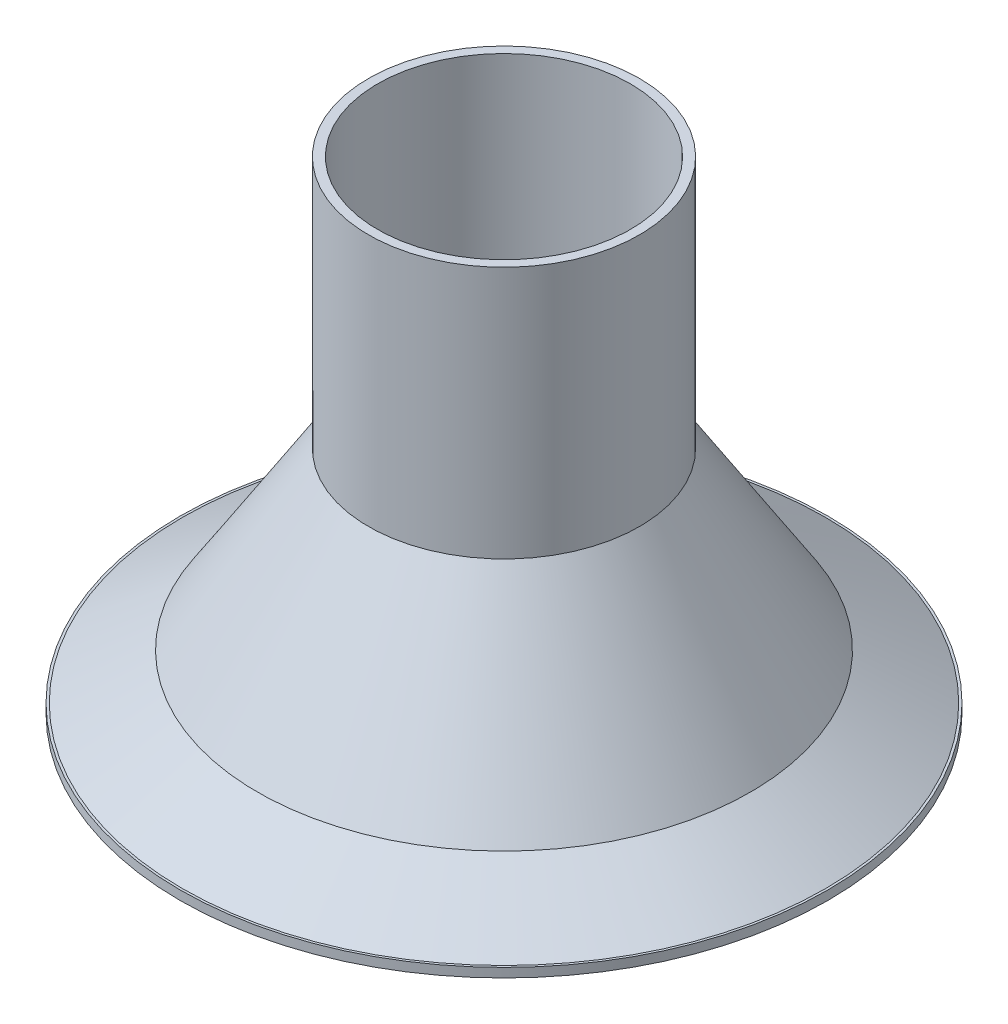
ISO-10303-21;
HEADER;
FILE_DESCRIPTION(('STEP AP214'),'2;1');
FILE_NAME('part.step','',(''),(''),'','','');
FILE_SCHEMA(('AUTOMOTIVE_DESIGN { 1 0 10303 214 1 1 1 1 }'));
ENDSEC;
DATA;
#1=APPLICATION_CONTEXT('core data for automotive mechanical design processes');
#2=APPLICATION_PROTOCOL_DEFINITION('international standard','automotive_design',2000,#1);
#3=PRODUCT_CONTEXT('',#1,'mechanical');
#4=PRODUCT('Part','Part','',(#3));
#5=PRODUCT_RELATED_PRODUCT_CATEGORY('part','',(#4));
#6=PRODUCT_DEFINITION_FORMATION('','',#4);
#7=PRODUCT_DEFINITION_CONTEXT('part definition',#1,'design');
#8=PRODUCT_DEFINITION('design','',#6,#7);
#9=PRODUCT_DEFINITION_SHAPE('','',#8);
#10=(LENGTH_UNIT() NAMED_UNIT(*) SI_UNIT(.MILLI.,.METRE.));
#11=(NAMED_UNIT(*) PLANE_ANGLE_UNIT() SI_UNIT($,.RADIAN.));
#12=(NAMED_UNIT(*) SI_UNIT($,.STERADIAN.) SOLID_ANGLE_UNIT());
#13=UNCERTAINTY_MEASURE_WITH_UNIT(LENGTH_MEASURE(1.E-05),#10,'distance_accuracy_value','');
#14=(GEOMETRIC_REPRESENTATION_CONTEXT(3) GLOBAL_UNCERTAINTY_ASSIGNED_CONTEXT((#13)) GLOBAL_UNIT_ASSIGNED_CONTEXT((#10,
#11,#12)) REPRESENTATION_CONTEXT('',''));
#15=CARTESIAN_POINT('',(0.,0.,0.));
#16=DIRECTION('',(0.,0.,1.));
#17=DIRECTION('',(1.,0.,0.));
#18=AXIS2_PLACEMENT_3D('',#15,#16,#17);
#19=CARTESIAN_POINT('',(-29.,0.,0.));
#20=DIRECTION('',(0.,1.,0.));
#21=DIRECTION('',(0.,0.,1.));
#22=AXIS2_PLACEMENT_3D('',#19,#20,#21);
#23=PLANE('',#22);
#24=CARTESIAN_POINT('',(0.,0.,0.));
#25=DIRECTION('',(0.,-1.,0.));
#26=DIRECTION('',(0.,0.,-1.));
#27=AXIS2_PLACEMENT_3D('',#24,#25,#26);
#28=CIRCLE('',#27,23.5604922191281);
#29=CARTESIAN_POINT('',(0.,0.,-23.5604922191281));
#30=VERTEX_POINT('',#29);
#31=EDGE_CURVE('E52',#30,#30,#28,.T.);
#32=ORIENTED_EDGE('',*,*,#31,.F.);
#33=EDGE_LOOP('',(#32));
#34=FACE_BOUND('',#33,.T.);
#35=CARTESIAN_POINT('',(0.,0.,0.));
#36=DIRECTION('',(0.,-1.,0.));
#37=DIRECTION('',(0.,0.,-1.));
#38=AXIS2_PLACEMENT_3D('',#35,#36,#37);
#39=CIRCLE('',#38,28.2);
#40=CARTESIAN_POINT('',(0.,0.,-28.2));
#41=VERTEX_POINT('',#40);
#42=EDGE_CURVE('E55',#41,#41,#39,.T.);
#43=ORIENTED_EDGE('',*,*,#42,.T.);
#44=EDGE_LOOP('',(#43));
#45=FACE_BOUND('',#44,.T.);
#46=ADVANCED_FACE('F32',(#34,#45),#23,.F.);
#47=CARTESIAN_POINT('',(-29.,0.799999999999996,0.));
#48=DIRECTION('',(0.,-1.,0.));
#49=DIRECTION('',(0.,0.,-1.));
#50=AXIS2_PLACEMENT_3D('',#47,#48,#49);
#51=PLANE('',#50);
#52=CARTESIAN_POINT('',(0.,0.799999999999996,0.));
#53=DIRECTION('',(0.,-1.,0.));
#54=DIRECTION('',(0.,0.,-1.));
#55=AXIS2_PLACEMENT_3D('',#52,#53,#54);
#56=CIRCLE('',#55,28.);
#57=CARTESIAN_POINT('',(0.,0.799999999999996,-28.));
#58=VERTEX_POINT('',#57);
#59=EDGE_CURVE('E61',#58,#58,#56,.T.);
#60=ORIENTED_EDGE('',*,*,#59,.T.);
#61=EDGE_LOOP('',(#60));
#62=FACE_BOUND('',#61,.T.);
#63=CARTESIAN_POINT('',(0.,0.799999999999997,0.));
#64=DIRECTION('',(0.,-1.,0.));
#65=DIRECTION('',(0.,0.,-1.));
#66=AXIS2_PLACEMENT_3D('',#63,#64,#65);
#67=CIRCLE('',#66,28.2);
#68=CARTESIAN_POINT('',(0.,0.799999999999997,-28.2));
#69=VERTEX_POINT('',#68);
#70=EDGE_CURVE('E58',#69,#69,#67,.T.);
#71=ORIENTED_EDGE('',*,*,#70,.F.);
#72=EDGE_LOOP('',(#71));
#73=FACE_BOUND('',#72,.T.);
#74=ADVANCED_FACE('F73',(#62,#73),#51,.F.);
#75=CARTESIAN_POINT('',(0.,20.,0.));
#76=DIRECTION('',(0.,-1.,0.));
#77=DIRECTION('',(0.,0.,-1.));
#78=AXIS2_PLACEMENT_3D('',#75,#76,#77);
#79=CONICAL_SURFACE('',#78,11.8,0.566054908792261);
#80=CARTESIAN_POINT('',(0.,4.8,0.));
#81=DIRECTION('',(0.,-1.,0.));
#82=DIRECTION('',(0.,0.,-1.));
#83=AXIS2_PLACEMENT_3D('',#80,#81,#82);
#84=CIRCLE('',#83,21.4583333333333);
#85=CARTESIAN_POINT('',(0.,4.8,-21.4583333333333));
#86=VERTEX_POINT('',#85);
#87=EDGE_CURVE('E64',#86,#86,#84,.T.);
#88=ORIENTED_EDGE('',*,*,#87,.F.);
#89=EDGE_LOOP('',(#88));
#90=FACE_BOUND('',#89,.T.);
#91=CARTESIAN_POINT('',(0.,20.,0.));
#92=DIRECTION('',(0.,-1.,0.));
#93=DIRECTION('',(0.,0.,-1.));
#94=AXIS2_PLACEMENT_3D('',#91,#92,#93);
#95=CIRCLE('',#94,11.8);
#96=CARTESIAN_POINT('',(0.,20.,-11.8));
#97=VERTEX_POINT('',#96);
#98=EDGE_CURVE('E10',#97,#97,#95,.T.);
#99=ORIENTED_EDGE('',*,*,#98,.T.);
#100=EDGE_LOOP('',(#99));
#101=FACE_BOUND('',#100,.T.);
#102=ADVANCED_FACE('F34',(#90,#101),#79,.T.);
#103=CARTESIAN_POINT('',(0.,0.,0.));
#104=DIRECTION('',(0.,-1.,0.));
#105=DIRECTION('',(0.,0.,-1.));
#106=AXIS2_PLACEMENT_3D('',#103,#104,#105);
#107=CYLINDRICAL_SURFACE('',#106,11.8);
#108=ORIENTED_EDGE('',*,*,#98,.F.);
#109=EDGE_LOOP('',(#108));
#110=FACE_BOUND('',#109,.T.);
#111=CARTESIAN_POINT('',(0.,42.,0.));
#112=DIRECTION('',(0.,-1.,0.));
#113=DIRECTION('',(0.,0.,-1.));
#114=AXIS2_PLACEMENT_3D('',#111,#112,#113);
#115=CIRCLE('',#114,11.8);
#116=CARTESIAN_POINT('',(0.,42.,-11.8));
#117=VERTEX_POINT('',#116);
#118=EDGE_CURVE('E39',#117,#117,#115,.T.);
#119=ORIENTED_EDGE('',*,*,#118,.T.);
#120=EDGE_LOOP('',(#119));
#121=FACE_BOUND('',#120,.T.);
#122=ADVANCED_FACE('F72',(#110,#121),#107,.T.);
#123=CARTESIAN_POINT('',(-11.8,42.,0.));
#124=DIRECTION('',(0.,-1.,0.));
#125=DIRECTION('',(0.,0.,-1.));
#126=AXIS2_PLACEMENT_3D('',#123,#124,#125);
#127=PLANE('',#126);
#128=ORIENTED_EDGE('',*,*,#118,.F.);
#129=EDGE_LOOP('',(#128));
#130=FACE_BOUND('',#129,.T.);
#131=CARTESIAN_POINT('',(0.,42.,0.));
#132=DIRECTION('',(0.,-1.,0.));
#133=DIRECTION('',(0.,0.,-1.));
#134=AXIS2_PLACEMENT_3D('',#131,#132,#133);
#135=CIRCLE('',#134,11.);
#136=CARTESIAN_POINT('',(0.,42.,-11.));
#137=VERTEX_POINT('',#136);
#138=EDGE_CURVE('E43',#137,#137,#135,.T.);
#139=ORIENTED_EDGE('',*,*,#138,.T.);
#140=EDGE_LOOP('',(#139));
#141=FACE_BOUND('',#140,.T.);
#142=ADVANCED_FACE('F77',(#130,#141),#127,.F.);
#143=CARTESIAN_POINT('',(0.,0.,0.));
#144=DIRECTION('',(0.,-1.,0.));
#145=DIRECTION('',(0.,0.,-1.));
#146=AXIS2_PLACEMENT_3D('',#143,#144,#145);
#147=CYLINDRICAL_SURFACE('',#146,11.);
#148=ORIENTED_EDGE('',*,*,#138,.F.);
#149=EDGE_LOOP('',(#148));
#150=FACE_BOUND('',#149,.T.);
#151=CARTESIAN_POINT('',(0.,19.7673320169885,0.));
#152=DIRECTION('',(0.,-1.,0.));
#153=DIRECTION('',(0.,0.,-1.));
#154=AXIS2_PLACEMENT_3D('',#151,#152,#153);
#155=CIRCLE('',#154,11.);
#156=CARTESIAN_POINT('',(0.,19.7673320169885,-11.));
#157=VERTEX_POINT('',#156);
#158=EDGE_CURVE('E47',#157,#157,#155,.T.);
#159=ORIENTED_EDGE('',*,*,#158,.T.);
#160=EDGE_LOOP('',(#159));
#161=FACE_BOUND('',#160,.T.);
#162=ADVANCED_FACE('F96',(#150,#161),#147,.F.);
#163=CARTESIAN_POINT('',(0.,0.,0.));
#164=DIRECTION('',(0.,-1.,0.));
#165=DIRECTION('',(0.,0.,-1.));
#166=AXIS2_PLACEMENT_3D('',#163,#164,#165);
#167=CONICAL_SURFACE('',#166,23.5604922191281,0.566054908792261);
#168=ORIENTED_EDGE('',*,*,#158,.F.);
#169=EDGE_LOOP('',(#168));
#170=FACE_BOUND('',#169,.T.);
#171=ORIENTED_EDGE('',*,*,#31,.T.);
#172=EDGE_LOOP('',(#171));
#173=FACE_BOUND('',#172,.T.);
#174=ADVANCED_FACE('F92',(#170,#173),#167,.F.);
#175=CARTESIAN_POINT('',(0.,0.,0.));
#176=DIRECTION('',(0.,-1.,0.));
#177=DIRECTION('',(0.,0.,-1.));
#178=AXIS2_PLACEMENT_3D('',#175,#176,#177);
#179=CYLINDRICAL_SURFACE('',#178,28.2);
#180=ORIENTED_EDGE('',*,*,#70,.T.);
#181=EDGE_LOOP('',(#180));
#182=FACE_BOUND('',#181,.T.);
#183=ORIENTED_EDGE('',*,*,#42,.F.);
#184=EDGE_LOOP('',(#183));
#185=FACE_BOUND('',#184,.T.);
#186=ADVANCED_FACE('F95',(#182,#185),#179,.T.);
#187=CARTESIAN_POINT('',(0.,0.799999999999996,0.));
#188=DIRECTION('',(0.,-1.,0.));
#189=DIRECTION('',(0.,0.,-1.));
#190=AXIS2_PLACEMENT_3D('',#187,#188,#189);
#191=CONICAL_SURFACE('',#190,28.,1.02198932517438);
#192=ORIENTED_EDGE('',*,*,#87,.T.);
#193=EDGE_LOOP('',(#192));
#194=FACE_BOUND('',#193,.T.);
#195=ORIENTED_EDGE('',*,*,#59,.F.);
#196=EDGE_LOOP('',(#195));
#197=FACE_BOUND('',#196,.T.);
#198=ADVANCED_FACE('F68',(#194,#197),#191,.T.);
#199=CLOSED_SHELL('',(#46,#74,#102,#122,#142,#162,#174,#186,#198));
#200=MANIFOLD_SOLID_BREP('B2',#199);
#201=ADVANCED_BREP_SHAPE_REPRESENTATION('',(#18,#200),#14);
#202=SHAPE_DEFINITION_REPRESENTATION(#9,#201);
ENDSEC;
END-ISO-10303-21;
